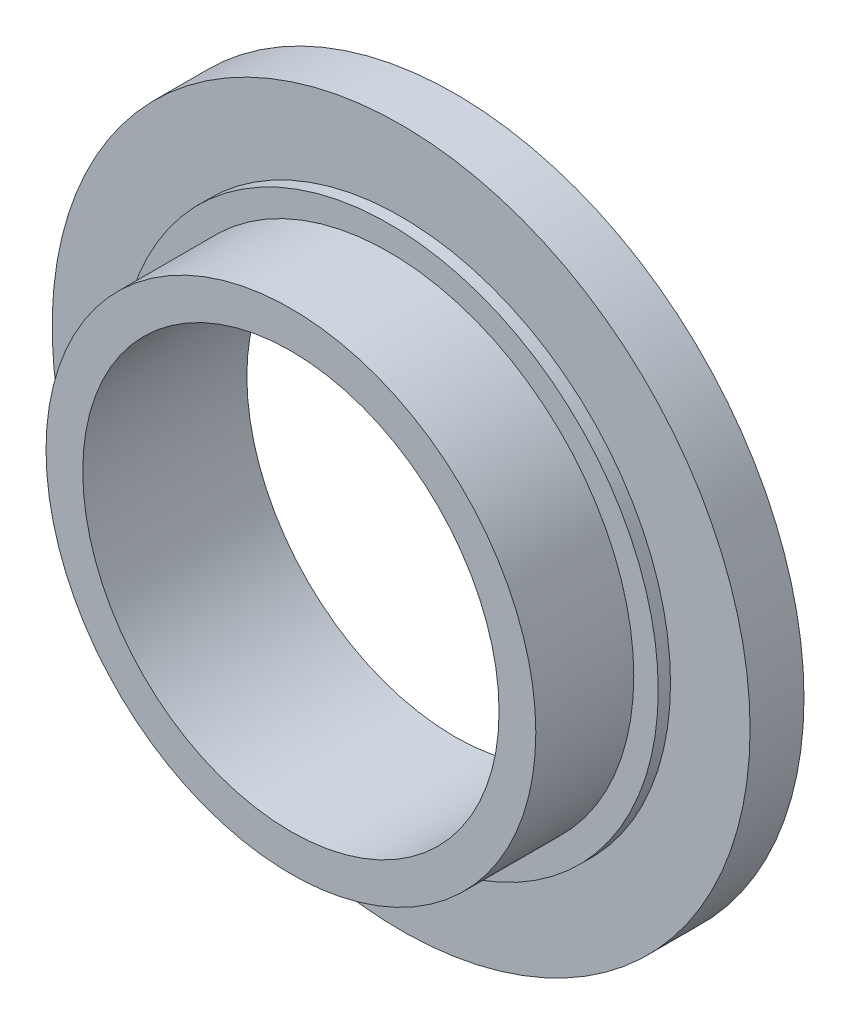
ISO-10303-21;
HEADER;
FILE_DESCRIPTION(('STEP AP214'),'2;1');
FILE_NAME('part.step','',(''),(''),'','','');
FILE_SCHEMA(('AUTOMOTIVE_DESIGN { 1 0 10303 214 1 1 1 1 }'));
ENDSEC;
DATA;
#1=APPLICATION_CONTEXT('core data for automotive mechanical design processes');
#2=APPLICATION_PROTOCOL_DEFINITION('international standard','automotive_design',2000,#1);
#3=PRODUCT_CONTEXT('',#1,'mechanical');
#4=PRODUCT('Part','Part','',(#3));
#5=PRODUCT_RELATED_PRODUCT_CATEGORY('part','',(#4));
#6=PRODUCT_DEFINITION_FORMATION('','',#4);
#7=PRODUCT_DEFINITION_CONTEXT('part definition',#1,'design');
#8=PRODUCT_DEFINITION('design','',#6,#7);
#9=PRODUCT_DEFINITION_SHAPE('','',#8);
#10=(LENGTH_UNIT() NAMED_UNIT(*) SI_UNIT(.MILLI.,.METRE.));
#11=(NAMED_UNIT(*) PLANE_ANGLE_UNIT() SI_UNIT($,.RADIAN.));
#12=(NAMED_UNIT(*) SI_UNIT($,.STERADIAN.) SOLID_ANGLE_UNIT());
#13=UNCERTAINTY_MEASURE_WITH_UNIT(LENGTH_MEASURE(1.E-05),#10,'distance_accuracy_value','');
#14=(GEOMETRIC_REPRESENTATION_CONTEXT(3) GLOBAL_UNCERTAINTY_ASSIGNED_CONTEXT((#13)) GLOBAL_UNIT_ASSIGNED_CONTEXT((#10,
#11,#12)) REPRESENTATION_CONTEXT('',''));
#15=CARTESIAN_POINT('',(0.,0.,0.));
#16=DIRECTION('',(0.,0.,1.));
#17=DIRECTION('',(1.,0.,0.));
#18=AXIS2_PLACEMENT_3D('',#15,#16,#17);
#19=CARTESIAN_POINT('',(0.,0.,2.7));
#20=DIRECTION('',(0.,0.,1.));
#21=DIRECTION('',(1.,0.,0.));
#22=AXIS2_PLACEMENT_3D('',#19,#20,#21);
#23=PLANE('',#22);
#24=CARTESIAN_POINT('',(0.,0.,2.7));
#25=DIRECTION('',(0.,0.,1.));
#26=DIRECTION('',(1.,0.,0.));
#27=AXIS2_PLACEMENT_3D('',#24,#25,#26);
#28=CIRCLE('',#27,11.);
#29=CARTESIAN_POINT('',(11.,0.,2.7));
#30=VERTEX_POINT('',#29);
#31=EDGE_CURVE('E35',#30,#30,#28,.T.);
#32=ORIENTED_EDGE('',*,*,#31,.T.);
#33=EDGE_LOOP('',(#32));
#34=FACE_BOUND('',#33,.T.);
#35=CARTESIAN_POINT('',(0.,0.,2.7));
#36=DIRECTION('',(0.,0.,1.));
#37=DIRECTION('',(1.,0.,0.));
#38=AXIS2_PLACEMENT_3D('',#35,#36,#37);
#39=CIRCLE('',#38,10.);
#40=CARTESIAN_POINT('',(10.,0.,2.7));
#41=VERTEX_POINT('',#40);
#42=EDGE_CURVE('E47',#41,#41,#39,.T.);
#43=ORIENTED_EDGE('',*,*,#42,.F.);
#44=EDGE_LOOP('',(#43));
#45=FACE_BOUND('',#44,.T.);
#46=ADVANCED_FACE('F24',(#34,#45),#23,.T.);
#47=CARTESIAN_POINT('',(0.,0.,2.2));
#48=DIRECTION('',(0.,0.,1.));
#49=DIRECTION('',(1.,0.,0.));
#50=AXIS2_PLACEMENT_3D('',#47,#48,#49);
#51=PLANE('',#50);
#52=CARTESIAN_POINT('',(0.,0.,2.2));
#53=DIRECTION('',(0.,0.,1.));
#54=DIRECTION('',(1.,0.,0.));
#55=AXIS2_PLACEMENT_3D('',#52,#53,#54);
#56=CIRCLE('',#55,14.25);
#57=CARTESIAN_POINT('',(14.25,0.,2.2));
#58=VERTEX_POINT('',#57);
#59=EDGE_CURVE('E10',#58,#58,#56,.T.);
#60=ORIENTED_EDGE('',*,*,#59,.T.);
#61=EDGE_LOOP('',(#60));
#62=FACE_BOUND('',#61,.T.);
#63=CARTESIAN_POINT('',(0.,0.,2.2));
#64=DIRECTION('',(0.,0.,1.));
#65=DIRECTION('',(1.,0.,0.));
#66=AXIS2_PLACEMENT_3D('',#63,#64,#65);
#67=CIRCLE('',#66,11.);
#68=CARTESIAN_POINT('',(11.,0.,2.2));
#69=VERTEX_POINT('',#68);
#70=EDGE_CURVE('E39',#69,#69,#67,.T.);
#71=ORIENTED_EDGE('',*,*,#70,.F.);
#72=EDGE_LOOP('',(#71));
#73=FACE_BOUND('',#72,.T.);
#74=ADVANCED_FACE('F73',(#62,#73),#51,.T.);
#75=CARTESIAN_POINT('',(0.,0.,2.2));
#76=DIRECTION('',(0.,0.,-1.));
#77=DIRECTION('',(-1.,0.,0.));
#78=AXIS2_PLACEMENT_3D('',#75,#76,#77);
#79=CYLINDRICAL_SURFACE('',#78,14.25);
#80=ORIENTED_EDGE('',*,*,#59,.F.);
#81=EDGE_LOOP('',(#80));
#82=FACE_BOUND('',#81,.T.);
#83=CARTESIAN_POINT('',(0.,0.,0.));
#84=DIRECTION('',(0.,0.,1.));
#85=DIRECTION('',(1.,0.,0.));
#86=AXIS2_PLACEMENT_3D('',#83,#84,#85);
#87=CIRCLE('',#86,14.25);
#88=CARTESIAN_POINT('',(14.25,0.,0.));
#89=VERTEX_POINT('',#88);
#90=EDGE_CURVE('E31',#89,#89,#87,.T.);
#91=ORIENTED_EDGE('',*,*,#90,.T.);
#92=EDGE_LOOP('',(#91));
#93=FACE_BOUND('',#92,.T.);
#94=ADVANCED_FACE('F26',(#82,#93),#79,.T.);
#95=CARTESIAN_POINT('',(0.,0.,0.));
#96=DIRECTION('',(0.,0.,1.));
#97=DIRECTION('',(1.,0.,0.));
#98=AXIS2_PLACEMENT_3D('',#95,#96,#97);
#99=PLANE('',#98);
#100=CARTESIAN_POINT('',(0.,0.,0.));
#101=DIRECTION('',(0.,0.,1.));
#102=DIRECTION('',(1.,0.,0.));
#103=AXIS2_PLACEMENT_3D('',#100,#101,#102);
#104=CIRCLE('',#103,8.5);
#105=CARTESIAN_POINT('',(8.5,0.,0.));
#106=VERTEX_POINT('',#105);
#107=EDGE_CURVE('E50',#106,#106,#104,.T.);
#108=ORIENTED_EDGE('',*,*,#107,.T.);
#109=EDGE_LOOP('',(#108));
#110=FACE_BOUND('',#109,.T.);
#111=ORIENTED_EDGE('',*,*,#90,.F.);
#112=EDGE_LOOP('',(#111));
#113=FACE_BOUND('',#112,.T.);
#114=ADVANCED_FACE('F82',(#110,#113),#99,.F.);
#115=CARTESIAN_POINT('',(0.,0.,2.7));
#116=DIRECTION('',(0.,0.,-1.));
#117=DIRECTION('',(-1.,0.,0.));
#118=AXIS2_PLACEMENT_3D('',#115,#116,#117);
#119=CYLINDRICAL_SURFACE('',#118,11.);
#120=ORIENTED_EDGE('',*,*,#31,.F.);
#121=EDGE_LOOP('',(#120));
#122=FACE_BOUND('',#121,.T.);
#123=ORIENTED_EDGE('',*,*,#70,.T.);
#124=EDGE_LOOP('',(#123));
#125=FACE_BOUND('',#124,.T.);
#126=ADVANCED_FACE('F68',(#122,#125),#119,.T.);
#127=CARTESIAN_POINT('',(0.,0.,6.7));
#128=DIRECTION('',(0.,0.,-1.));
#129=DIRECTION('',(-1.,0.,0.));
#130=AXIS2_PLACEMENT_3D('',#127,#128,#129);
#131=CYLINDRICAL_SURFACE('',#130,10.);
#132=CARTESIAN_POINT('',(0.,0.,6.7));
#133=DIRECTION('',(0.,0.,1.));
#134=DIRECTION('',(1.,0.,0.));
#135=AXIS2_PLACEMENT_3D('',#132,#133,#134);
#136=CIRCLE('',#135,10.);
#137=CARTESIAN_POINT('',(10.,0.,6.7));
#138=VERTEX_POINT('',#137);
#139=EDGE_CURVE('E44',#138,#138,#136,.T.);
#140=ORIENTED_EDGE('',*,*,#139,.F.);
#141=EDGE_LOOP('',(#140));
#142=FACE_BOUND('',#141,.T.);
#143=ORIENTED_EDGE('',*,*,#42,.T.);
#144=EDGE_LOOP('',(#143));
#145=FACE_BOUND('',#144,.T.);
#146=ADVANCED_FACE('F62',(#142,#145),#131,.T.);
#147=CARTESIAN_POINT('',(0.,0.,6.7));
#148=DIRECTION('',(0.,0.,1.));
#149=DIRECTION('',(1.,0.,0.));
#150=AXIS2_PLACEMENT_3D('',#147,#148,#149);
#151=PLANE('',#150);
#152=CARTESIAN_POINT('',(0.,0.,6.7));
#153=DIRECTION('',(0.,0.,1.));
#154=DIRECTION('',(1.,0.,0.));
#155=AXIS2_PLACEMENT_3D('',#152,#153,#154);
#156=CIRCLE('',#155,8.5);
#157=CARTESIAN_POINT('',(8.5,0.,6.7));
#158=VERTEX_POINT('',#157);
#159=EDGE_CURVE('E53',#158,#158,#156,.T.);
#160=ORIENTED_EDGE('',*,*,#159,.F.);
#161=EDGE_LOOP('',(#160));
#162=FACE_BOUND('',#161,.T.);
#163=ORIENTED_EDGE('',*,*,#139,.T.);
#164=EDGE_LOOP('',(#163));
#165=FACE_BOUND('',#164,.T.);
#166=ADVANCED_FACE('F59',(#162,#165),#151,.T.);
#167=CARTESIAN_POINT('',(0.,0.,0.));
#168=DIRECTION('',(0.,0.,1.));
#169=DIRECTION('',(1.,0.,0.));
#170=AXIS2_PLACEMENT_3D('',#167,#168,#169);
#171=CYLINDRICAL_SURFACE('',#170,8.5);
#172=ORIENTED_EDGE('',*,*,#107,.F.);
#173=EDGE_LOOP('',(#172));
#174=FACE_BOUND('',#173,.T.);
#175=ORIENTED_EDGE('',*,*,#159,.T.);
#176=EDGE_LOOP('',(#175));
#177=FACE_BOUND('',#176,.T.);
#178=ADVANCED_FACE('F57',(#174,#177),#171,.F.);
#179=CLOSED_SHELL('',(#46,#74,#94,#114,#126,#146,#166,#178));
#180=MANIFOLD_SOLID_BREP('B2',#179);
#181=ADVANCED_BREP_SHAPE_REPRESENTATION('',(#18,#180),#14);
#182=SHAPE_DEFINITION_REPRESENTATION(#9,#181);
ENDSEC;
END-ISO-10303-21;
